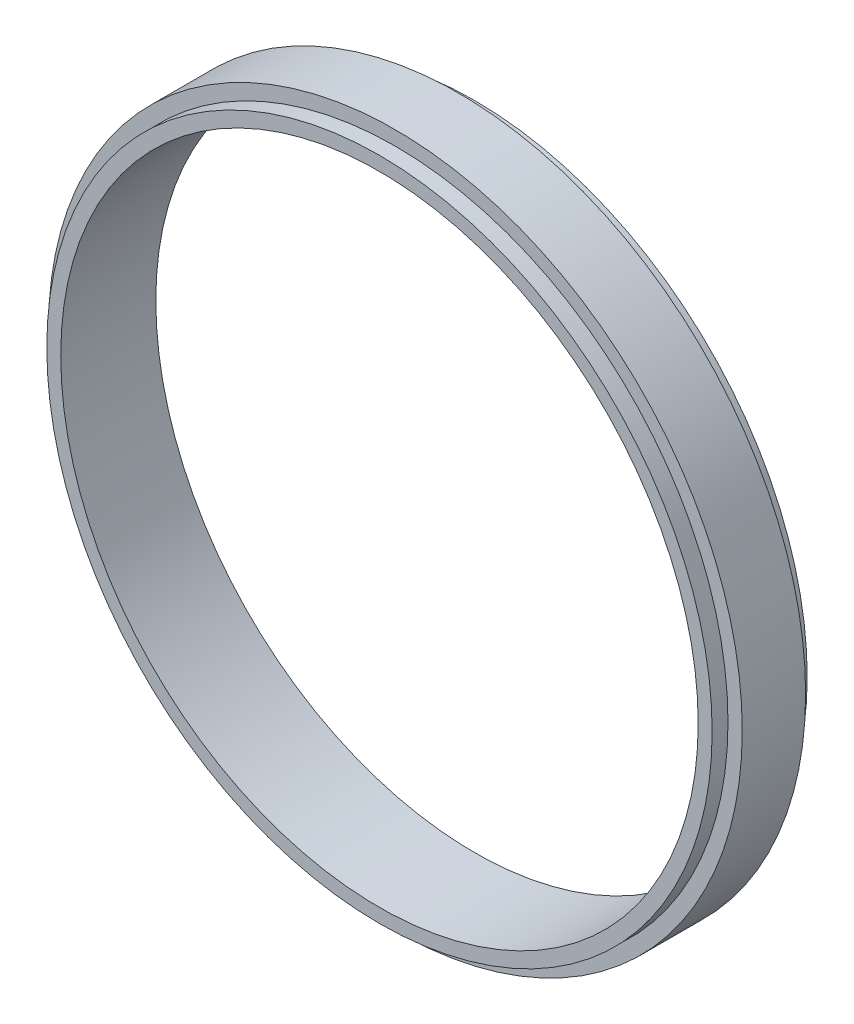
ISO-10303-21;
HEADER;
FILE_DESCRIPTION(('STEP AP214'),'2;1');
FILE_NAME('part.step','',(''),(''),'','','');
FILE_SCHEMA(('AUTOMOTIVE_DESIGN { 1 0 10303 214 1 1 1 1 }'));
ENDSEC;
DATA;
#1=APPLICATION_CONTEXT('core data for automotive mechanical design processes');
#2=APPLICATION_PROTOCOL_DEFINITION('international standard','automotive_design',2000,#1);
#3=PRODUCT_CONTEXT('',#1,'mechanical');
#4=PRODUCT('Part','Part','',(#3));
#5=PRODUCT_RELATED_PRODUCT_CATEGORY('part','',(#4));
#6=PRODUCT_DEFINITION_FORMATION('','',#4);
#7=PRODUCT_DEFINITION_CONTEXT('part definition',#1,'design');
#8=PRODUCT_DEFINITION('design','',#6,#7);
#9=PRODUCT_DEFINITION_SHAPE('','',#8);
#10=(LENGTH_UNIT() NAMED_UNIT(*) SI_UNIT(.MILLI.,.METRE.));
#11=(NAMED_UNIT(*) PLANE_ANGLE_UNIT() SI_UNIT($,.RADIAN.));
#12=(NAMED_UNIT(*) SI_UNIT($,.STERADIAN.) SOLID_ANGLE_UNIT());
#13=UNCERTAINTY_MEASURE_WITH_UNIT(LENGTH_MEASURE(1.E-05),#10,'distance_accuracy_value','');
#14=(GEOMETRIC_REPRESENTATION_CONTEXT(3) GLOBAL_UNCERTAINTY_ASSIGNED_CONTEXT((#13)) GLOBAL_UNIT_ASSIGNED_CONTEXT((#10,
#11,#12)) REPRESENTATION_CONTEXT('',''));
#15=CARTESIAN_POINT('',(0.,0.,0.));
#16=DIRECTION('',(0.,0.,1.));
#17=DIRECTION('',(1.,0.,0.));
#18=AXIS2_PLACEMENT_3D('',#15,#16,#17);
#19=CARTESIAN_POINT('',(0.,0.,6.));
#20=DIRECTION('',(0.,0.,-1.));
#21=DIRECTION('',(-1.,0.,0.));
#22=AXIS2_PLACEMENT_3D('',#19,#20,#21);
#23=CYLINDRICAL_SURFACE('',#22,21.);
#24=CARTESIAN_POINT('',(0.,0.,0.));
#25=DIRECTION('',(0.,0.,1.));
#26=DIRECTION('',(1.,0.,0.));
#27=AXIS2_PLACEMENT_3D('',#24,#25,#26);
#28=CIRCLE('',#27,21.);
#29=CARTESIAN_POINT('',(21.,0.,0.));
#30=VERTEX_POINT('',#29);
#31=EDGE_CURVE('E41',#30,#30,#28,.T.);
#32=ORIENTED_EDGE('',*,*,#31,.T.);
#33=EDGE_LOOP('',(#32));
#34=FACE_BOUND('',#33,.T.);
#35=CARTESIAN_POINT('',(0.,0.,1.));
#36=DIRECTION('',(0.,0.,1.));
#37=DIRECTION('',(1.,0.,0.));
#38=AXIS2_PLACEMENT_3D('',#35,#36,#37);
#39=CIRCLE('',#38,21.);
#40=CARTESIAN_POINT('',(21.,0.,1.));
#41=VERTEX_POINT('',#40);
#42=EDGE_CURVE('E10',#41,#41,#39,.T.);
#43=ORIENTED_EDGE('',*,*,#42,.F.);
#44=EDGE_LOOP('',(#43));
#45=FACE_BOUND('',#44,.T.);
#46=ADVANCED_FACE('F40',(#34,#45),#23,.T.);
#47=CARTESIAN_POINT('',(0.,0.,6.));
#48=DIRECTION('',(0.,0.,1.));
#49=DIRECTION('',(1.,0.,0.));
#50=AXIS2_PLACEMENT_3D('',#47,#48,#49);
#51=PLANE('',#50);
#52=CARTESIAN_POINT('',(0.,0.,6.));
#53=DIRECTION('',(0.,0.,1.));
#54=DIRECTION('',(1.,0.,0.));
#55=AXIS2_PLACEMENT_3D('',#52,#53,#54);
#56=CIRCLE('',#55,21.);
#57=CARTESIAN_POINT('',(21.,0.,6.));
#58=VERTEX_POINT('',#57);
#59=EDGE_CURVE('E44',#58,#58,#56,.T.);
#60=ORIENTED_EDGE('',*,*,#59,.T.);
#61=EDGE_LOOP('',(#60));
#62=FACE_BOUND('',#61,.T.);
#63=CARTESIAN_POINT('',(0.,0.,6.));
#64=DIRECTION('',(0.,0.,1.));
#65=DIRECTION('',(1.,0.,0.));
#66=AXIS2_PLACEMENT_3D('',#63,#64,#65);
#67=CIRCLE('',#66,20.12);
#68=CARTESIAN_POINT('',(20.12,0.,6.));
#69=VERTEX_POINT('',#68);
#70=EDGE_CURVE('E56',#69,#69,#67,.T.);
#71=ORIENTED_EDGE('',*,*,#70,.F.);
#72=EDGE_LOOP('',(#71));
#73=FACE_BOUND('',#72,.T.);
#74=ADVANCED_FACE('F81',(#62,#73),#51,.T.);
#75=CARTESIAN_POINT('',(0.,0.,0.));
#76=DIRECTION('',(0.,0.,1.));
#77=DIRECTION('',(1.,0.,0.));
#78=AXIS2_PLACEMENT_3D('',#75,#76,#77);
#79=PLANE('',#78);
#80=ORIENTED_EDGE('',*,*,#31,.F.);
#81=EDGE_LOOP('',(#80));
#82=FACE_BOUND('',#81,.T.);
#83=CARTESIAN_POINT('',(0.,0.,0.));
#84=DIRECTION('',(0.,0.,1.));
#85=DIRECTION('',(1.,0.,0.));
#86=AXIS2_PLACEMENT_3D('',#83,#84,#85);
#87=CIRCLE('',#86,20.12);
#88=CARTESIAN_POINT('',(20.12,0.,0.));
#89=VERTEX_POINT('',#88);
#90=EDGE_CURVE('E60',#89,#89,#87,.T.);
#91=ORIENTED_EDGE('',*,*,#90,.T.);
#92=EDGE_LOOP('',(#91));
#93=FACE_BOUND('',#92,.T.);
#94=ADVANCED_FACE('F62',(#82,#93),#79,.F.);
#95=CARTESIAN_POINT('',(0.,0.,5.));
#96=DIRECTION('',(0.,0.,1.));
#97=DIRECTION('',(1.,0.,0.));
#98=AXIS2_PLACEMENT_3D('',#95,#96,#97);
#99=CIRCLE('',#98,21.);
#100=CARTESIAN_POINT('',(21.,0.,5.));
#101=VERTEX_POINT('',#100);
#102=EDGE_CURVE('E53',#101,#101,#99,.T.);
#103=ORIENTED_EDGE('',*,*,#102,.T.);
#104=EDGE_LOOP('',(#103));
#105=FACE_BOUND('',#104,.T.);
#106=ORIENTED_EDGE('',*,*,#59,.F.);
#107=EDGE_LOOP('',(#106));
#108=FACE_BOUND('',#107,.T.);
#109=ADVANCED_FACE('F39',(#105,#108),#23,.T.);
#110=CARTESIAN_POINT('',(0.,0.,6.));
#111=DIRECTION('',(0.,0.,-1.));
#112=DIRECTION('',(-1.,0.,0.));
#113=AXIS2_PLACEMENT_3D('',#110,#111,#112);
#114=CYLINDRICAL_SURFACE('',#113,20.12);
#115=ORIENTED_EDGE('',*,*,#70,.T.);
#116=EDGE_LOOP('',(#115));
#117=FACE_BOUND('',#116,.T.);
#118=ORIENTED_EDGE('',*,*,#90,.F.);
#119=EDGE_LOOP('',(#118));
#120=FACE_BOUND('',#119,.T.);
#121=ADVANCED_FACE('F70',(#117,#120),#114,.F.);
#122=CARTESIAN_POINT('',(0.,0.,5.));
#123=DIRECTION('',(0.,0.,1.));
#124=DIRECTION('',(1.,0.,0.));
#125=AXIS2_PLACEMENT_3D('',#122,#123,#124);
#126=PLANE('',#125);
#127=CARTESIAN_POINT('',(0.,0.,5.));
#128=DIRECTION('',(0.,0.,1.));
#129=DIRECTION('',(1.,0.,0.));
#130=AXIS2_PLACEMENT_3D('',#127,#128,#129);
#131=CIRCLE('',#130,21.9);
#132=CARTESIAN_POINT('',(21.9,0.,5.));
#133=VERTEX_POINT('',#132);
#134=EDGE_CURVE('E59',#133,#133,#131,.T.);
#135=ORIENTED_EDGE('',*,*,#134,.T.);
#136=EDGE_LOOP('',(#135));
#137=FACE_BOUND('',#136,.T.);
#138=ORIENTED_EDGE('',*,*,#102,.F.);
#139=EDGE_LOOP('',(#138));
#140=FACE_BOUND('',#139,.T.);
#141=ADVANCED_FACE('F67',(#137,#140),#126,.T.);
#142=CARTESIAN_POINT('',(0.,0.,1.));
#143=DIRECTION('',(0.,0.,1.));
#144=DIRECTION('',(1.,0.,0.));
#145=AXIS2_PLACEMENT_3D('',#142,#143,#144);
#146=PLANE('',#145);
#147=CARTESIAN_POINT('',(0.,0.,1.));
#148=DIRECTION('',(0.,0.,1.));
#149=DIRECTION('',(1.,0.,0.));
#150=AXIS2_PLACEMENT_3D('',#147,#148,#149);
#151=CIRCLE('',#150,21.9);
#152=CARTESIAN_POINT('',(21.9,0.,1.));
#153=VERTEX_POINT('',#152);
#154=EDGE_CURVE('E55',#153,#153,#151,.T.);
#155=ORIENTED_EDGE('',*,*,#154,.F.);
#156=EDGE_LOOP('',(#155));
#157=FACE_BOUND('',#156,.T.);
#158=ORIENTED_EDGE('',*,*,#42,.T.);
#159=EDGE_LOOP('',(#158));
#160=FACE_BOUND('',#159,.T.);
#161=ADVANCED_FACE('F79',(#157,#160),#146,.F.);
#162=CARTESIAN_POINT('',(0.,0.,5.));
#163=DIRECTION('',(0.,0.,-1.));
#164=DIRECTION('',(-1.,0.,0.));
#165=AXIS2_PLACEMENT_3D('',#162,#163,#164);
#166=CYLINDRICAL_SURFACE('',#165,21.9);
#167=ORIENTED_EDGE('',*,*,#134,.F.);
#168=EDGE_LOOP('',(#167));
#169=FACE_BOUND('',#168,.T.);
#170=ORIENTED_EDGE('',*,*,#154,.T.);
#171=EDGE_LOOP('',(#170));
#172=FACE_BOUND('',#171,.T.);
#173=ADVANCED_FACE('F129',(#169,#172),#166,.T.);
#174=CLOSED_SHELL('',(#46,#74,#94,#109,#121,#141,#161,#173));
#175=MANIFOLD_SOLID_BREP('B2',#174);
#176=ADVANCED_BREP_SHAPE_REPRESENTATION('',(#18,#175),#14);
#177=SHAPE_DEFINITION_REPRESENTATION(#9,#176);
ENDSEC;
END-ISO-10303-21;
